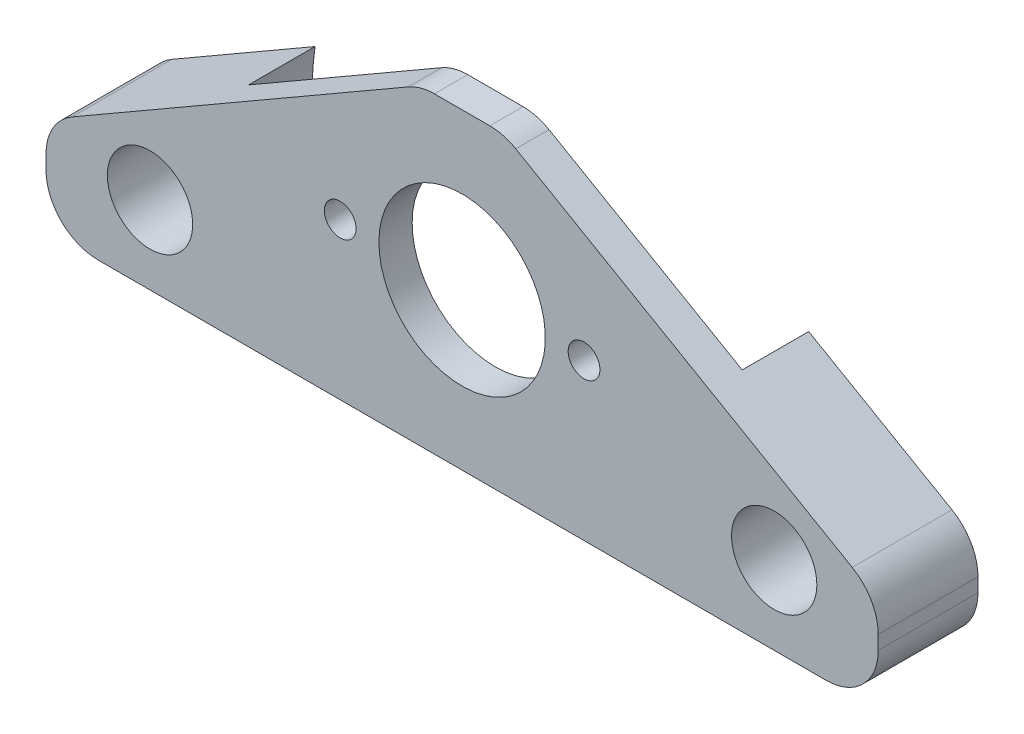
ISO-10303-21;
HEADER;
FILE_DESCRIPTION(('STEP AP214'),'2;1');
FILE_NAME('part.step','',(''),(''),'','','');
FILE_SCHEMA(('AUTOMOTIVE_DESIGN { 1 0 10303 214 1 1 1 1 }'));
ENDSEC;
DATA;
#1=APPLICATION_CONTEXT('core data for automotive mechanical design processes');
#2=APPLICATION_PROTOCOL_DEFINITION('international standard','automotive_design',2000,#1);
#3=PRODUCT_CONTEXT('',#1,'mechanical');
#4=PRODUCT('Part','Part','',(#3));
#5=PRODUCT_RELATED_PRODUCT_CATEGORY('part','',(#4));
#6=PRODUCT_DEFINITION_FORMATION('','',#4);
#7=PRODUCT_DEFINITION_CONTEXT('part definition',#1,'design');
#8=PRODUCT_DEFINITION('design','',#6,#7);
#9=PRODUCT_DEFINITION_SHAPE('','',#8);
#10=(LENGTH_UNIT() NAMED_UNIT(*) SI_UNIT(.MILLI.,.METRE.));
#11=(NAMED_UNIT(*) PLANE_ANGLE_UNIT() SI_UNIT($,.RADIAN.));
#12=(NAMED_UNIT(*) SI_UNIT($,.STERADIAN.) SOLID_ANGLE_UNIT());
#13=UNCERTAINTY_MEASURE_WITH_UNIT(LENGTH_MEASURE(1.E-05),#10,'distance_accuracy_value','');
#14=(GEOMETRIC_REPRESENTATION_CONTEXT(3) GLOBAL_UNCERTAINTY_ASSIGNED_CONTEXT((#13)) GLOBAL_UNIT_ASSIGNED_CONTEXT((#10,
#11,#12)) REPRESENTATION_CONTEXT('',''));
#15=CARTESIAN_POINT('',(0.,0.,0.));
#16=DIRECTION('',(0.,0.,1.));
#17=DIRECTION('',(1.,0.,0.));
#18=AXIS2_PLACEMENT_3D('',#15,#16,#17);
#19=CARTESIAN_POINT('',(0.,19.05,-3.03));
#20=DIRECTION('',(0.,0.,1.));
#21=DIRECTION('',(1.,0.,0.));
#22=AXIS2_PLACEMENT_3D('',#19,#20,#21);
#23=PLANE('',#22);
#24=CARTESIAN_POINT('',(0.,9.525,-3.03));
#25=DIRECTION('',(0.,0.,1.));
#26=DIRECTION('',(1.,0.,0.));
#27=AXIS2_PLACEMENT_3D('',#24,#25,#26);
#28=CIRCLE('',#27,5.08);
#29=CARTESIAN_POINT('',(5.08,9.525,-3.03));
#30=VERTEX_POINT('',#29);
#31=EDGE_CURVE('E248',#30,#30,#28,.T.);
#32=ORIENTED_EDGE('',*,*,#31,.T.);
#33=EDGE_LOOP('',(#32));
#34=FACE_BOUND('',#33,.T.);
#35=CARTESIAN_POINT('',(7.44219999999999,9.525,-3.03));
#36=DIRECTION('',(0.,0.,1.));
#37=DIRECTION('',(1.,0.,0.));
#38=AXIS2_PLACEMENT_3D('',#35,#36,#37);
#39=CIRCLE('',#38,0.97028000000001);
#40=CARTESIAN_POINT('',(8.41248000000001,9.525,-3.03));
#41=VERTEX_POINT('',#40);
#42=EDGE_CURVE('E236',#41,#41,#39,.T.);
#43=ORIENTED_EDGE('',*,*,#42,.T.);
#44=EDGE_LOOP('',(#43));
#45=FACE_BOUND('',#44,.T.);
#46=DIRECTION('',(-1.,0.,0.));
#47=VECTOR('',#46,1.);
#48=CARTESIAN_POINT('',(2.54000378596879,19.05,-3.03));
#49=LINE('',#48,#47);
#50=CARTESIAN_POINT('',(1.68926509999997,19.05,-3.03));
#51=VERTEX_POINT('',#50);
#52=CARTESIAN_POINT('',(-1.68926509999997,19.05,-3.03));
#53=VERTEX_POINT('',#52);
#54=EDGE_CURVE('E264',#51,#53,#49,.T.);
#55=ORIENTED_EDGE('',*,*,#54,.F.);
#56=CARTESIAN_POINT('',(1.68926509999997,15.875,-3.03));
#57=DIRECTION('',(0.,0.,1.));
#58=DIRECTION('',(1.,0.,0.));
#59=AXIS2_PLACEMENT_3D('',#56,#57,#58);
#60=CIRCLE('',#59,3.175);
#61=CARTESIAN_POINT('',(3.27676509999997,18.6246306570156,-3.03));
#62=VERTEX_POINT('',#61);
#63=EDGE_CURVE('E291',#51,#62,#60,.F.);
#64=ORIENTED_EDGE('',*,*,#63,.T.);
#65=DIRECTION('',(-0.866025403784439,0.5,0.));
#66=VECTOR('',#65,1.);
#67=CARTESIAN_POINT('',(25.4,5.85177503215525,-3.03));
#68=LINE('',#67,#66);
#69=CARTESIAN_POINT('',(15.0665413190862,11.8178001832408,-3.03));
#70=VERTEX_POINT('',#69);
#71=EDGE_CURVE('E280',#70,#62,#68,.T.);
#72=ORIENTED_EDGE('',*,*,#71,.F.);
#73=CARTESIAN_POINT('',(0.,9.52499999999997,-3.03));
#74=DIRECTION('',(0.,0.,1.));
#75=DIRECTION('',(-1.,0.,0.));
#76=AXIS2_PLACEMENT_3D('',#73,#74,#75);
#77=CIRCLE('',#76,15.24);
#78=CARTESIAN_POINT('',(11.896721186949,0.,-3.03));
#79=VERTEX_POINT('',#78);
#80=EDGE_CURVE('E251',#79,#70,#77,.T.);
#81=ORIENTED_EDGE('',*,*,#80,.F.);
#82=DIRECTION('',(1.,0.,0.));
#83=VECTOR('',#82,1.);
#84=CARTESIAN_POINT('',(0.,0.,-3.03));
#85=LINE('',#84,#83);
#86=CARTESIAN_POINT('',(-11.896721186949,0.,-3.03));
#87=VERTEX_POINT('',#86);
#88=EDGE_CURVE('E321',#87,#79,#85,.T.);
#89=ORIENTED_EDGE('',*,*,#88,.F.);
#90=CARTESIAN_POINT('',(0.,9.52499999999997,-3.03));
#91=DIRECTION('',(0.,0.,-1.));
#92=DIRECTION('',(1.,0.,0.));
#93=AXIS2_PLACEMENT_3D('',#90,#91,#92);
#94=CIRCLE('',#93,15.24);
#95=CARTESIAN_POINT('',(-15.0665413190862,11.8178001832408,-3.03));
#96=VERTEX_POINT('',#95);
#97=EDGE_CURVE('E161',#87,#96,#94,.T.);
#98=ORIENTED_EDGE('',*,*,#97,.T.);
#99=DIRECTION('',(0.866025403784439,0.5,0.));
#100=VECTOR('',#99,1.);
#101=CARTESIAN_POINT('',(-25.4,5.85177503215525,-3.03));
#102=LINE('',#101,#100);
#103=CARTESIAN_POINT('',(-3.27676509999997,18.6246306570156,-3.03));
#104=VERTEX_POINT('',#103);
#105=EDGE_CURVE('E174',#96,#104,#102,.T.);
#106=ORIENTED_EDGE('',*,*,#105,.T.);
#107=CARTESIAN_POINT('',(-1.68926509999997,15.875,-3.03));
#108=DIRECTION('',(0.,0.,-1.));
#109=DIRECTION('',(-1.,0.,0.));
#110=AXIS2_PLACEMENT_3D('',#107,#108,#109);
#111=CIRCLE('',#110,3.175);
#112=EDGE_CURVE('E218',#53,#104,#111,.F.);
#113=ORIENTED_EDGE('',*,*,#112,.F.);
#114=EDGE_LOOP('',(#55,#64,#72,#81,#89,#98,#106,#113));
#115=FACE_BOUND('',#114,.T.);
#116=CARTESIAN_POINT('',(-7.44219999999999,9.525,-3.03));
#117=DIRECTION('',(0.,0.,-1.));
#118=DIRECTION('',(-1.,0.,0.));
#119=AXIS2_PLACEMENT_3D('',#116,#117,#118);
#120=CIRCLE('',#119,0.97028000000001);
#121=CARTESIAN_POINT('',(-8.41248000000001,9.525,-3.03));
#122=VERTEX_POINT('',#121);
#123=EDGE_CURVE('E604',#122,#122,#120,.T.);
#124=ORIENTED_EDGE('',*,*,#123,.F.);
#125=EDGE_LOOP('',(#124));
#126=FACE_BOUND('',#125,.T.);
#127=ADVANCED_FACE('F36',(#34,#45,#115,#126),#23,.F.);
#128=CARTESIAN_POINT('',(2.54000378596879,19.05,-3.03));
#129=DIRECTION('',(0.,1.,0.));
#130=DIRECTION('',(0.,0.,1.));
#131=AXIS2_PLACEMENT_3D('',#128,#129,#130);
#132=PLANE('',#131);
#133=DIRECTION('',(-1.,0.,0.));
#134=VECTOR('',#133,1.);
#135=CARTESIAN_POINT('',(2.54000378596879,19.05,-1.));
#136=LINE('',#135,#134);
#137=CARTESIAN_POINT('',(1.68926509999997,19.05,-1.));
#138=VERTEX_POINT('',#137);
#139=CARTESIAN_POINT('',(-1.68926509999997,19.05,-1.));
#140=VERTEX_POINT('',#139);
#141=EDGE_CURVE('E314',#138,#140,#136,.T.);
#142=ORIENTED_EDGE('',*,*,#141,.F.);
#143=DIRECTION('',(0.,0.,1.));
#144=VECTOR('',#143,1.);
#145=CARTESIAN_POINT('',(1.68926509999997,19.05,-3.03));
#146=LINE('',#145,#144);
#147=EDGE_CURVE('E289',#138,#51,#146,.F.);
#148=ORIENTED_EDGE('',*,*,#147,.T.);
#149=ORIENTED_EDGE('',*,*,#54,.T.);
#150=DIRECTION('',(0.,0.,1.));
#151=VECTOR('',#150,1.);
#152=CARTESIAN_POINT('',(-1.68926509999997,19.05,-3.03));
#153=LINE('',#152,#151);
#154=EDGE_CURVE('E215',#140,#53,#153,.F.);
#155=ORIENTED_EDGE('',*,*,#154,.F.);
#156=EDGE_LOOP('',(#142,#148,#149,#155));
#157=FACE_BOUND('',#156,.T.);
#158=ADVANCED_FACE('F342',(#157),#132,.T.);
#159=CARTESIAN_POINT('',(25.4,5.85177503215525,-3.03));
#160=DIRECTION('',(0.5,0.866025403784439,0.));
#161=DIRECTION('',(-0.866025403784439,0.5,0.));
#162=AXIS2_PLACEMENT_3D('',#159,#160,#161);
#163=PLANE('',#162);
#164=ORIENTED_EDGE('',*,*,#71,.T.);
#165=DIRECTION('',(0.,0.,1.));
#166=VECTOR('',#165,1.);
#167=CARTESIAN_POINT('',(3.27676509999997,18.6246306570156,-3.03));
#168=LINE('',#167,#166);
#169=CARTESIAN_POINT('',(3.27676509999997,18.6246306570156,-1.));
#170=VERTEX_POINT('',#169);
#171=EDGE_CURVE('E279',#62,#170,#168,.T.);
#172=ORIENTED_EDGE('',*,*,#171,.T.);
#173=DIRECTION('',(-0.866025403784439,0.5,0.));
#174=VECTOR('',#173,1.);
#175=CARTESIAN_POINT('',(25.4,5.85177503215525,-1.));
#176=LINE('',#175,#174);
#177=CARTESIAN_POINT('',(23.8125,6.76831858449378,-1.));
#178=VERTEX_POINT('',#177);
#179=EDGE_CURVE('E310',#178,#170,#176,.T.);
#180=ORIENTED_EDGE('',*,*,#179,.F.);
#181=DIRECTION('',(0.,0.,1.));
#182=VECTOR('',#181,1.);
#183=CARTESIAN_POINT('',(23.8125,6.76831858449378,-3.03));
#184=LINE('',#183,#182);
#185=CARTESIAN_POINT('',(23.8125,6.76831858449379,-7.09));
#186=VERTEX_POINT('',#185);
#187=EDGE_CURVE('E277',#178,#186,#184,.F.);
#188=ORIENTED_EDGE('',*,*,#187,.T.);
#189=DIRECTION('',(0.866025403784436,-0.500000000000004,0.));
#190=VECTOR('',#189,1.);
#191=CARTESIAN_POINT('',(25.4,5.85177503215525,-7.09));
#192=LINE('',#191,#190);
#193=CARTESIAN_POINT('',(15.0665413190862,11.8178001832408,-7.09));
#194=VERTEX_POINT('',#193);
#195=EDGE_CURVE('E255',#194,#186,#192,.T.);
#196=ORIENTED_EDGE('',*,*,#195,.F.);
#197=DIRECTION('',(0.,0.,1.));
#198=VECTOR('',#197,1.);
#199=CARTESIAN_POINT('',(15.0665413190862,11.8178001832408,-7.09));
#200=LINE('',#199,#198);
#201=EDGE_CURVE('E274',#194,#70,#200,.T.);
#202=ORIENTED_EDGE('',*,*,#201,.T.);
#203=EDGE_LOOP('',(#164,#172,#180,#188,#196,#202));
#204=FACE_BOUND('',#203,.T.);
#205=ADVANCED_FACE('F328',(#204),#163,.T.);
#206=CARTESIAN_POINT('',(25.4,0.,-3.03));
#207=DIRECTION('',(1.,0.,0.));
#208=DIRECTION('',(0.,0.,-1.));
#209=AXIS2_PLACEMENT_3D('',#206,#207,#208);
#210=PLANE('',#209);
#211=DIRECTION('',(0.,1.,0.));
#212=VECTOR('',#211,1.);
#213=CARTESIAN_POINT('',(25.4,0.,-1.));
#214=LINE('',#213,#212);
#215=CARTESIAN_POINT('',(25.4,3.175,-1.));
#216=VERTEX_POINT('',#215);
#217=CARTESIAN_POINT('',(25.4,4.01868792747819,-1.));
#218=VERTEX_POINT('',#217);
#219=EDGE_CURVE('E302',#216,#218,#214,.T.);
#220=ORIENTED_EDGE('',*,*,#219,.F.);
#221=DIRECTION('',(0.,0.,1.));
#222=VECTOR('',#221,1.);
#223=CARTESIAN_POINT('',(25.4,3.175,-3.03));
#224=LINE('',#223,#222);
#225=CARTESIAN_POINT('',(25.4,3.175,-7.09));
#226=VERTEX_POINT('',#225);
#227=EDGE_CURVE('E51',#216,#226,#224,.F.);
#228=ORIENTED_EDGE('',*,*,#227,.T.);
#229=DIRECTION('',(0.,-1.,0.));
#230=VECTOR('',#229,1.);
#231=CARTESIAN_POINT('',(25.4,0.,-7.09));
#232=LINE('',#231,#230);
#233=CARTESIAN_POINT('',(25.4,4.01868792747819,-7.09));
#234=VERTEX_POINT('',#233);
#235=EDGE_CURVE('E257',#234,#226,#232,.T.);
#236=ORIENTED_EDGE('',*,*,#235,.F.);
#237=DIRECTION('',(0.,0.,1.));
#238=VECTOR('',#237,1.);
#239=CARTESIAN_POINT('',(25.4,4.01868792747819,-3.03));
#240=LINE('',#239,#238);
#241=EDGE_CURVE('E296',#234,#218,#240,.T.);
#242=ORIENTED_EDGE('',*,*,#241,.T.);
#243=EDGE_LOOP('',(#220,#228,#236,#242));
#244=FACE_BOUND('',#243,.T.);
#245=ADVANCED_FACE('F301',(#244),#210,.T.);
#246=CARTESIAN_POINT('',(0.,0.,-3.03));
#247=DIRECTION('',(0.,-1.,0.));
#248=DIRECTION('',(0.,0.,-1.));
#249=AXIS2_PLACEMENT_3D('',#246,#247,#248);
#250=PLANE('',#249);
#251=DIRECTION('',(-1.,0.,0.));
#252=VECTOR('',#251,1.);
#253=CARTESIAN_POINT('',(11.8967211869489,0.,-7.09));
#254=LINE('',#253,#252);
#255=CARTESIAN_POINT('',(22.225,0.,-7.09));
#256=VERTEX_POINT('',#255);
#257=CARTESIAN_POINT('',(11.8967211869489,0.,-7.09));
#258=VERTEX_POINT('',#257);
#259=EDGE_CURVE('E259',#256,#258,#254,.T.);
#260=ORIENTED_EDGE('',*,*,#259,.F.);
#261=DIRECTION('',(0.,0.,1.));
#262=VECTOR('',#261,1.);
#263=CARTESIAN_POINT('',(22.225,0.,-3.03));
#264=LINE('',#263,#262);
#265=CARTESIAN_POINT('',(22.225,0.,-1.));
#266=VERTEX_POINT('',#265);
#267=EDGE_CURVE('E293',#256,#266,#264,.T.);
#268=ORIENTED_EDGE('',*,*,#267,.T.);
#269=DIRECTION('',(1.,0.,0.));
#270=VECTOR('',#269,1.);
#271=CARTESIAN_POINT('',(0.,0.,-1.));
#272=LINE('',#271,#270);
#273=CARTESIAN_POINT('',(-22.225,0.,-1.));
#274=VERTEX_POINT('',#273);
#275=EDGE_CURVE('E311',#274,#266,#272,.T.);
#276=ORIENTED_EDGE('',*,*,#275,.F.);
#277=DIRECTION('',(0.,0.,1.));
#278=VECTOR('',#277,1.);
#279=CARTESIAN_POINT('',(-22.225,0.,-3.03));
#280=LINE('',#279,#278);
#281=CARTESIAN_POINT('',(-22.225,0.,-7.09));
#282=VERTEX_POINT('',#281);
#283=EDGE_CURVE('E221',#282,#274,#280,.T.);
#284=ORIENTED_EDGE('',*,*,#283,.F.);
#285=DIRECTION('',(1.,0.,0.));
#286=VECTOR('',#285,1.);
#287=CARTESIAN_POINT('',(-11.8967211869489,0.,-7.09));
#288=LINE('',#287,#286);
#289=CARTESIAN_POINT('',(-11.8967211869489,0.,-7.09));
#290=VERTEX_POINT('',#289);
#291=EDGE_CURVE('E181',#282,#290,#288,.T.);
#292=ORIENTED_EDGE('',*,*,#291,.T.);
#293=DIRECTION('',(0.,0.,1.));
#294=VECTOR('',#293,1.);
#295=CARTESIAN_POINT('',(-11.8967211869489,0.,-7.09));
#296=LINE('',#295,#294);
#297=EDGE_CURVE('E156',#290,#87,#296,.T.);
#298=ORIENTED_EDGE('',*,*,#297,.T.);
#299=ORIENTED_EDGE('',*,*,#88,.T.);
#300=DIRECTION('',(0.,0.,1.));
#301=VECTOR('',#300,1.);
#302=CARTESIAN_POINT('',(11.8967211869489,0.,-7.09));
#303=LINE('',#302,#301);
#304=EDGE_CURVE('E261',#258,#79,#303,.T.);
#305=ORIENTED_EDGE('',*,*,#304,.F.);
#306=EDGE_LOOP('',(#260,#268,#276,#284,#292,#298,#299,#305));
#307=FACE_BOUND('',#306,.T.);
#308=ADVANCED_FACE('F339',(#307),#250,.T.);
#309=CARTESIAN_POINT('',(0.,19.05,-1.));
#310=DIRECTION('',(0.,0.,1.));
#311=DIRECTION('',(1.,0.,0.));
#312=AXIS2_PLACEMENT_3D('',#309,#310,#311);
#313=PLANE('',#312);
#314=CARTESIAN_POINT('',(0.,9.525,-1.));
#315=DIRECTION('',(0.,0.,-1.));
#316=DIRECTION('',(-1.,0.,0.));
#317=AXIS2_PLACEMENT_3D('',#314,#315,#316);
#318=CIRCLE('',#317,5.08);
#319=CARTESIAN_POINT('',(-5.08,9.525,-1.));
#320=VERTEX_POINT('',#319);
#321=EDGE_CURVE('E243',#320,#320,#318,.T.);
#322=ORIENTED_EDGE('',*,*,#321,.T.);
#323=EDGE_LOOP('',(#322));
#324=FACE_BOUND('',#323,.T.);
#325=CARTESIAN_POINT('',(7.44219999999999,9.525,-1.));
#326=DIRECTION('',(0.,0.,-1.));
#327=DIRECTION('',(1.,0.,0.));
#328=AXIS2_PLACEMENT_3D('',#325,#326,#327);
#329=CIRCLE('',#328,0.97028000000001);
#330=CARTESIAN_POINT('',(8.41248000000001,9.525,-1.));
#331=VERTEX_POINT('',#330);
#332=EDGE_CURVE('E233',#331,#331,#329,.T.);
#333=ORIENTED_EDGE('',*,*,#332,.T.);
#334=EDGE_LOOP('',(#333));
#335=FACE_BOUND('',#334,.T.);
#336=CARTESIAN_POINT('',(19.05,4.7625,-1.));
#337=DIRECTION('',(0.,0.,-1.));
#338=DIRECTION('',(1.,0.,0.));
#339=AXIS2_PLACEMENT_3D('',#336,#337,#338);
#340=CIRCLE('',#339,2.60349999999999);
#341=CARTESIAN_POINT('',(21.6535,4.7625,-1.));
#342=VERTEX_POINT('',#341);
#343=EDGE_CURVE('E240',#342,#342,#340,.T.);
#344=ORIENTED_EDGE('',*,*,#343,.T.);
#345=EDGE_LOOP('',(#344));
#346=FACE_BOUND('',#345,.T.);
#347=ORIENTED_EDGE('',*,*,#179,.T.);
#348=CARTESIAN_POINT('',(1.68926509999997,15.875,-1.));
#349=DIRECTION('',(0.,0.,1.));
#350=DIRECTION('',(1.,0.,0.));
#351=AXIS2_PLACEMENT_3D('',#348,#349,#350);
#352=CIRCLE('',#351,3.175);
#353=EDGE_CURVE('E287',#170,#138,#352,.T.);
#354=ORIENTED_EDGE('',*,*,#353,.T.);
#355=ORIENTED_EDGE('',*,*,#141,.T.);
#356=CARTESIAN_POINT('',(-1.68926509999997,15.875,-1.));
#357=DIRECTION('',(0.,0.,-1.));
#358=DIRECTION('',(-1.,0.,0.));
#359=AXIS2_PLACEMENT_3D('',#356,#357,#358);
#360=CIRCLE('',#359,3.175);
#361=CARTESIAN_POINT('',(-3.27676509999997,18.6246306570156,-1.));
#362=VERTEX_POINT('',#361);
#363=EDGE_CURVE('E212',#362,#140,#360,.T.);
#364=ORIENTED_EDGE('',*,*,#363,.F.);
#365=DIRECTION('',(0.866025403784439,0.5,0.));
#366=VECTOR('',#365,1.);
#367=CARTESIAN_POINT('',(-25.4,5.85177503215525,-1.));
#368=LINE('',#367,#366);
#369=CARTESIAN_POINT('',(-23.8125,6.76831858449378,-1.));
#370=VERTEX_POINT('',#369);
#371=EDGE_CURVE('E179',#370,#362,#368,.T.);
#372=ORIENTED_EDGE('',*,*,#371,.F.);
#373=CARTESIAN_POINT('',(-22.225,4.01868792747819,-1.));
#374=DIRECTION('',(0.,0.,-1.));
#375=DIRECTION('',(-1.,0.,0.));
#376=AXIS2_PLACEMENT_3D('',#373,#374,#375);
#377=CIRCLE('',#376,3.175);
#378=CARTESIAN_POINT('',(-25.4,4.01868792747819,-1.));
#379=VERTEX_POINT('',#378);
#380=EDGE_CURVE('E205',#379,#370,#377,.T.);
#381=ORIENTED_EDGE('',*,*,#380,.F.);
#382=DIRECTION('',(0.,1.,0.));
#383=VECTOR('',#382,1.);
#384=CARTESIAN_POINT('',(-25.4,0.,-1.));
#385=LINE('',#384,#383);
#386=CARTESIAN_POINT('',(-25.4,3.175,-1.));
#387=VERTEX_POINT('',#386);
#388=EDGE_CURVE('E176',#387,#379,#385,.T.);
#389=ORIENTED_EDGE('',*,*,#388,.F.);
#390=CARTESIAN_POINT('',(-22.225,3.175,-1.));
#391=DIRECTION('',(0.,0.,-1.));
#392=DIRECTION('',(-1.,0.,0.));
#393=AXIS2_PLACEMENT_3D('',#390,#391,#392);
#394=CIRCLE('',#393,3.175);
#395=EDGE_CURVE('E210',#274,#387,#394,.T.);
#396=ORIENTED_EDGE('',*,*,#395,.F.);
#397=ORIENTED_EDGE('',*,*,#275,.T.);
#398=CARTESIAN_POINT('',(22.225,3.175,-1.));
#399=DIRECTION('',(0.,0.,1.));
#400=DIRECTION('',(1.,0.,0.));
#401=AXIS2_PLACEMENT_3D('',#398,#399,#400);
#402=CIRCLE('',#401,3.175);
#403=EDGE_CURVE('E285',#266,#216,#402,.T.);
#404=ORIENTED_EDGE('',*,*,#403,.T.);
#405=ORIENTED_EDGE('',*,*,#219,.T.);
#406=CARTESIAN_POINT('',(22.225,4.01868792747819,-1.));
#407=DIRECTION('',(0.,0.,1.));
#408=DIRECTION('',(1.,0.,0.));
#409=AXIS2_PLACEMENT_3D('',#406,#407,#408);
#410=CIRCLE('',#409,3.175);
#411=EDGE_CURVE('E283',#218,#178,#410,.T.);
#412=ORIENTED_EDGE('',*,*,#411,.T.);
#413=EDGE_LOOP('',(#347,#354,#355,#364,#372,#381,#389,#396,#397,#404,#405,#412));
#414=FACE_BOUND('',#413,.T.);
#415=CARTESIAN_POINT('',(-7.44219999999999,9.525,-1.));
#416=DIRECTION('',(0.,0.,1.));
#417=DIRECTION('',(-1.,0.,0.));
#418=AXIS2_PLACEMENT_3D('',#415,#416,#417);
#419=CIRCLE('',#418,0.97028000000001);
#420=CARTESIAN_POINT('',(-8.41248000000001,9.525,-1.));
#421=VERTEX_POINT('',#420);
#422=EDGE_CURVE('E601',#421,#421,#419,.T.);
#423=ORIENTED_EDGE('',*,*,#422,.F.);
#424=EDGE_LOOP('',(#423));
#425=FACE_BOUND('',#424,.T.);
#426=CARTESIAN_POINT('',(-19.05,4.7625,-1.));
#427=DIRECTION('',(0.,0.,1.));
#428=DIRECTION('',(-1.,0.,0.));
#429=AXIS2_PLACEMENT_3D('',#426,#427,#428);
#430=CIRCLE('',#429,2.60349999999999);
#431=CARTESIAN_POINT('',(-21.6535,4.7625,-1.));
#432=VERTEX_POINT('',#431);
#433=EDGE_CURVE('E190',#432,#432,#430,.T.);
#434=ORIENTED_EDGE('',*,*,#433,.F.);
#435=EDGE_LOOP('',(#434));
#436=FACE_BOUND('',#435,.T.);
#437=ADVANCED_FACE('F306',(#324,#335,#346,#414,#425,#436),#313,.T.);
#438=CARTESIAN_POINT('',(0.,9.52499999999997,-7.09));
#439=DIRECTION('',(0.,0.,1.));
#440=DIRECTION('',(1.,0.,0.));
#441=AXIS2_PLACEMENT_3D('',#438,#439,#440);
#442=CYLINDRICAL_SURFACE('',#441,15.24);
#443=ORIENTED_EDGE('',*,*,#80,.T.);
#444=ORIENTED_EDGE('',*,*,#201,.F.);
#445=CARTESIAN_POINT('',(0.,9.52499999999997,-7.09));
#446=DIRECTION('',(0.,0.,1.));
#447=DIRECTION('',(-1.,0.,0.));
#448=AXIS2_PLACEMENT_3D('',#445,#446,#447);
#449=CIRCLE('',#448,15.24);
#450=EDGE_CURVE('E252',#258,#194,#449,.T.);
#451=ORIENTED_EDGE('',*,*,#450,.F.);
#452=ORIENTED_EDGE('',*,*,#304,.T.);
#453=EDGE_LOOP('',(#443,#444,#451,#452));
#454=FACE_BOUND('',#453,.T.);
#455=ADVANCED_FACE('F332',(#454),#442,.F.);
#456=CARTESIAN_POINT('',(0.,9.52499999999997,-7.09));
#457=DIRECTION('',(0.,0.,-1.));
#458=DIRECTION('',(-1.,0.,0.));
#459=AXIS2_PLACEMENT_3D('',#456,#457,#458);
#460=PLANE('',#459);
#461=CARTESIAN_POINT('',(19.05,4.7625,-7.09));
#462=DIRECTION('',(0.,0.,-1.));
#463=DIRECTION('',(1.,0.,0.));
#464=AXIS2_PLACEMENT_3D('',#461,#462,#463);
#465=CIRCLE('',#464,2.60349999999999);
#466=CARTESIAN_POINT('',(21.6535,4.7625,-7.09));
#467=VERTEX_POINT('',#466);
#468=EDGE_CURVE('E239',#467,#467,#465,.T.);
#469=ORIENTED_EDGE('',*,*,#468,.F.);
#470=EDGE_LOOP('',(#469));
#471=FACE_BOUND('',#470,.T.);
#472=ORIENTED_EDGE('',*,*,#235,.T.);
#473=CARTESIAN_POINT('',(22.225,3.175,-7.09));
#474=DIRECTION('',(0.,0.,-1.));
#475=DIRECTION('',(-1.,0.,0.));
#476=AXIS2_PLACEMENT_3D('',#473,#474,#475);
#477=CIRCLE('',#476,3.175);
#478=EDGE_CURVE('E11',#226,#256,#477,.T.);
#479=ORIENTED_EDGE('',*,*,#478,.T.);
#480=ORIENTED_EDGE('',*,*,#259,.T.);
#481=ORIENTED_EDGE('',*,*,#450,.T.);
#482=ORIENTED_EDGE('',*,*,#195,.T.);
#483=CARTESIAN_POINT('',(22.225,4.01868792747819,-7.09));
#484=DIRECTION('',(0.,0.,-1.));
#485=DIRECTION('',(-1.,0.,0.));
#486=AXIS2_PLACEMENT_3D('',#483,#484,#485);
#487=CIRCLE('',#486,3.175);
#488=EDGE_CURVE('E44',#186,#234,#487,.T.);
#489=ORIENTED_EDGE('',*,*,#488,.T.);
#490=EDGE_LOOP('',(#472,#479,#480,#481,#482,#489));
#491=FACE_BOUND('',#490,.T.);
#492=ADVANCED_FACE('F362',(#471,#491),#460,.T.);
#493=CARTESIAN_POINT('',(0.,9.525,-1.));
#494=DIRECTION('',(0.,0.,-1.));
#495=DIRECTION('',(-1.,0.,0.));
#496=AXIS2_PLACEMENT_3D('',#493,#494,#495);
#497=CYLINDRICAL_SURFACE('',#496,5.08);
#498=ORIENTED_EDGE('',*,*,#31,.F.);
#499=EDGE_LOOP('',(#498));
#500=FACE_BOUND('',#499,.T.);
#501=ORIENTED_EDGE('',*,*,#321,.F.);
#502=EDGE_LOOP('',(#501));
#503=FACE_BOUND('',#502,.T.);
#504=ADVANCED_FACE('F419',(#500,#503),#497,.F.);
#505=CARTESIAN_POINT('',(19.05,4.7625,-1.));
#506=DIRECTION('',(0.,0.,-1.));
#507=DIRECTION('',(-1.,0.,0.));
#508=AXIS2_PLACEMENT_3D('',#505,#506,#507);
#509=CYLINDRICAL_SURFACE('',#508,2.60349999999999);
#510=ORIENTED_EDGE('',*,*,#343,.F.);
#511=EDGE_LOOP('',(#510));
#512=FACE_BOUND('',#511,.T.);
#513=ORIENTED_EDGE('',*,*,#468,.T.);
#514=EDGE_LOOP('',(#513));
#515=FACE_BOUND('',#514,.T.);
#516=ADVANCED_FACE('F373',(#512,#515),#509,.F.);
#517=CARTESIAN_POINT('',(7.44219999999999,9.525,-1.));
#518=DIRECTION('',(0.,0.,-1.));
#519=DIRECTION('',(-1.,0.,0.));
#520=AXIS2_PLACEMENT_3D('',#517,#518,#519);
#521=CYLINDRICAL_SURFACE('',#520,0.97028000000001);
#522=ORIENTED_EDGE('',*,*,#332,.F.);
#523=EDGE_LOOP('',(#522));
#524=FACE_BOUND('',#523,.T.);
#525=ORIENTED_EDGE('',*,*,#42,.F.);
#526=EDGE_LOOP('',(#525));
#527=FACE_BOUND('',#526,.T.);
#528=ADVANCED_FACE('F367',(#524,#527),#521,.F.);
#529=CARTESIAN_POINT('',(1.68926509999997,15.875,-3.03));
#530=DIRECTION('',(0.,0.,1.));
#531=DIRECTION('',(1.,0.,0.));
#532=AXIS2_PLACEMENT_3D('',#529,#530,#531);
#533=CYLINDRICAL_SURFACE('',#532,3.175);
#534=ORIENTED_EDGE('',*,*,#63,.F.);
#535=ORIENTED_EDGE('',*,*,#147,.F.);
#536=ORIENTED_EDGE('',*,*,#353,.F.);
#537=ORIENTED_EDGE('',*,*,#171,.F.);
#538=EDGE_LOOP('',(#534,#535,#536,#537));
#539=FACE_BOUND('',#538,.T.);
#540=ADVANCED_FACE('F365',(#539),#533,.T.);
#541=CARTESIAN_POINT('',(22.225,3.175,-3.03));
#542=DIRECTION('',(0.,0.,1.));
#543=DIRECTION('',(1.,0.,0.));
#544=AXIS2_PLACEMENT_3D('',#541,#542,#543);
#545=CYLINDRICAL_SURFACE('',#544,3.175);
#546=ORIENTED_EDGE('',*,*,#478,.F.);
#547=ORIENTED_EDGE('',*,*,#227,.F.);
#548=ORIENTED_EDGE('',*,*,#403,.F.);
#549=ORIENTED_EDGE('',*,*,#267,.F.);
#550=EDGE_LOOP('',(#546,#547,#548,#549));
#551=FACE_BOUND('',#550,.T.);
#552=ADVANCED_FACE('F361',(#551),#545,.T.);
#553=CARTESIAN_POINT('',(22.225,4.01868792747819,-3.03));
#554=DIRECTION('',(0.,0.,1.));
#555=DIRECTION('',(1.,0.,0.));
#556=AXIS2_PLACEMENT_3D('',#553,#554,#555);
#557=CYLINDRICAL_SURFACE('',#556,3.175);
#558=ORIENTED_EDGE('',*,*,#488,.F.);
#559=ORIENTED_EDGE('',*,*,#187,.F.);
#560=ORIENTED_EDGE('',*,*,#411,.F.);
#561=ORIENTED_EDGE('',*,*,#241,.F.);
#562=EDGE_LOOP('',(#558,#559,#560,#561));
#563=FACE_BOUND('',#562,.T.);
#564=ADVANCED_FACE('F38',(#563),#557,.T.);
#565=CARTESIAN_POINT('',(-25.4,5.85177503215525,-3.03));
#566=DIRECTION('',(-0.5,0.866025403784439,0.));
#567=DIRECTION('',(0.866025403784439,0.5,0.));
#568=AXIS2_PLACEMENT_3D('',#565,#566,#567);
#569=PLANE('',#568);
#570=ORIENTED_EDGE('',*,*,#105,.F.);
#571=DIRECTION('',(0.,0.,1.));
#572=VECTOR('',#571,1.);
#573=CARTESIAN_POINT('',(-15.0665413190862,11.8178001832408,-7.09));
#574=LINE('',#573,#572);
#575=CARTESIAN_POINT('',(-15.0665413190862,11.8178001832408,-7.09));
#576=VERTEX_POINT('',#575);
#577=EDGE_CURVE('E153',#576,#96,#574,.T.);
#578=ORIENTED_EDGE('',*,*,#577,.F.);
#579=DIRECTION('',(-0.866025403784436,-0.500000000000004,0.));
#580=VECTOR('',#579,1.);
#581=CARTESIAN_POINT('',(-25.4,5.85177503215525,-7.09));
#582=LINE('',#581,#580);
#583=CARTESIAN_POINT('',(-23.8125,6.76831858449379,-7.09));
#584=VERTEX_POINT('',#583);
#585=EDGE_CURVE('E160',#576,#584,#582,.T.);
#586=ORIENTED_EDGE('',*,*,#585,.T.);
#587=DIRECTION('',(0.,0.,1.));
#588=VECTOR('',#587,1.);
#589=CARTESIAN_POINT('',(-23.8125,6.76831858449378,-3.03));
#590=LINE('',#589,#588);
#591=EDGE_CURVE('E198',#370,#584,#590,.F.);
#592=ORIENTED_EDGE('',*,*,#591,.F.);
#593=ORIENTED_EDGE('',*,*,#371,.T.);
#594=DIRECTION('',(0.,0.,1.));
#595=VECTOR('',#594,1.);
#596=CARTESIAN_POINT('',(-3.27676509999997,18.6246306570156,-3.03));
#597=LINE('',#596,#595);
#598=EDGE_CURVE('E201',#104,#362,#597,.T.);
#599=ORIENTED_EDGE('',*,*,#598,.F.);
#600=EDGE_LOOP('',(#570,#578,#586,#592,#593,#599));
#601=FACE_BOUND('',#600,.T.);
#602=ADVANCED_FACE('F172',(#601),#569,.T.);
#603=CARTESIAN_POINT('',(-25.4,0.,-3.03));
#604=DIRECTION('',(-1.,0.,0.));
#605=DIRECTION('',(0.,0.,-1.));
#606=AXIS2_PLACEMENT_3D('',#603,#604,#605);
#607=PLANE('',#606);
#608=ORIENTED_EDGE('',*,*,#388,.T.);
#609=DIRECTION('',(0.,0.,1.));
#610=VECTOR('',#609,1.);
#611=CARTESIAN_POINT('',(-25.4,4.01868792747819,-3.03));
#612=LINE('',#611,#610);
#613=CARTESIAN_POINT('',(-25.4,4.01868792747819,-7.09));
#614=VERTEX_POINT('',#613);
#615=EDGE_CURVE('E224',#614,#379,#612,.T.);
#616=ORIENTED_EDGE('',*,*,#615,.F.);
#617=DIRECTION('',(0.,-1.,0.));
#618=VECTOR('',#617,1.);
#619=CARTESIAN_POINT('',(-25.4,0.,-7.09));
#620=LINE('',#619,#618);
#621=CARTESIAN_POINT('',(-25.4,3.175,-7.09));
#622=VERTEX_POINT('',#621);
#623=EDGE_CURVE('E170',#614,#622,#620,.T.);
#624=ORIENTED_EDGE('',*,*,#623,.T.);
#625=DIRECTION('',(0.,0.,1.));
#626=VECTOR('',#625,1.);
#627=CARTESIAN_POINT('',(-25.4,3.175,-3.03));
#628=LINE('',#627,#626);
#629=EDGE_CURVE('E227',#387,#622,#628,.F.);
#630=ORIENTED_EDGE('',*,*,#629,.F.);
#631=EDGE_LOOP('',(#608,#616,#624,#630));
#632=FACE_BOUND('',#631,.T.);
#633=ADVANCED_FACE('F354',(#632),#607,.T.);
#634=CARTESIAN_POINT('',(0.,9.52499999999997,-7.09));
#635=DIRECTION('',(0.,0.,1.));
#636=DIRECTION('',(-1.,0.,0.));
#637=AXIS2_PLACEMENT_3D('',#634,#635,#636);
#638=CYLINDRICAL_SURFACE('',#637,15.24);
#639=ORIENTED_EDGE('',*,*,#97,.F.);
#640=ORIENTED_EDGE('',*,*,#297,.F.);
#641=CARTESIAN_POINT('',(0.,9.52499999999997,-7.09));
#642=DIRECTION('',(0.,0.,-1.));
#643=DIRECTION('',(1.,0.,0.));
#644=AXIS2_PLACEMENT_3D('',#641,#642,#643);
#645=CIRCLE('',#644,15.24);
#646=EDGE_CURVE('E148',#290,#576,#645,.T.);
#647=ORIENTED_EDGE('',*,*,#646,.T.);
#648=ORIENTED_EDGE('',*,*,#577,.T.);
#649=EDGE_LOOP('',(#639,#640,#647,#648));
#650=FACE_BOUND('',#649,.T.);
#651=ADVANCED_FACE('F151',(#650),#638,.F.);
#652=CARTESIAN_POINT('',(0.,9.52499999999997,-7.09));
#653=DIRECTION('',(0.,0.,-1.));
#654=DIRECTION('',(1.,0.,0.));
#655=AXIS2_PLACEMENT_3D('',#652,#653,#654);
#656=PLANE('',#655);
#657=CARTESIAN_POINT('',(-19.05,4.7625,-7.09));
#658=DIRECTION('',(0.,0.,1.));
#659=DIRECTION('',(-1.,0.,0.));
#660=AXIS2_PLACEMENT_3D('',#657,#658,#659);
#661=CIRCLE('',#660,2.60349999999999);
#662=CARTESIAN_POINT('',(-21.6535,4.7625,-7.09));
#663=VERTEX_POINT('',#662);
#664=EDGE_CURVE('E605',#663,#663,#661,.T.);
#665=ORIENTED_EDGE('',*,*,#664,.T.);
#666=EDGE_LOOP('',(#665));
#667=FACE_BOUND('',#666,.T.);
#668=ORIENTED_EDGE('',*,*,#623,.F.);
#669=CARTESIAN_POINT('',(-22.225,4.01868792747819,-7.09));
#670=DIRECTION('',(0.,0.,1.));
#671=DIRECTION('',(1.,0.,0.));
#672=AXIS2_PLACEMENT_3D('',#669,#670,#671);
#673=CIRCLE('',#672,3.175);
#674=EDGE_CURVE('E166',#584,#614,#673,.T.);
#675=ORIENTED_EDGE('',*,*,#674,.F.);
#676=ORIENTED_EDGE('',*,*,#585,.F.);
#677=ORIENTED_EDGE('',*,*,#646,.F.);
#678=ORIENTED_EDGE('',*,*,#291,.F.);
#679=CARTESIAN_POINT('',(-22.225,3.175,-7.09));
#680=DIRECTION('',(0.,0.,1.));
#681=DIRECTION('',(1.,0.,0.));
#682=AXIS2_PLACEMENT_3D('',#679,#680,#681);
#683=CIRCLE('',#682,3.175);
#684=EDGE_CURVE('E231',#622,#282,#683,.T.);
#685=ORIENTED_EDGE('',*,*,#684,.F.);
#686=EDGE_LOOP('',(#668,#675,#676,#677,#678,#685));
#687=FACE_BOUND('',#686,.T.);
#688=ADVANCED_FACE('F165',(#667,#687),#656,.T.);
#689=CARTESIAN_POINT('',(-19.05,4.7625,-1.));
#690=DIRECTION('',(0.,0.,-1.));
#691=DIRECTION('',(1.,0.,0.));
#692=AXIS2_PLACEMENT_3D('',#689,#690,#691);
#693=CYLINDRICAL_SURFACE('',#692,2.60349999999999);
#694=ORIENTED_EDGE('',*,*,#433,.T.);
#695=EDGE_LOOP('',(#694));
#696=FACE_BOUND('',#695,.T.);
#697=ORIENTED_EDGE('',*,*,#664,.F.);
#698=EDGE_LOOP('',(#697));
#699=FACE_BOUND('',#698,.T.);
#700=ADVANCED_FACE('F533',(#696,#699),#693,.F.);
#701=CARTESIAN_POINT('',(-7.44219999999999,9.525,-1.));
#702=DIRECTION('',(0.,0.,-1.));
#703=DIRECTION('',(1.,0.,0.));
#704=AXIS2_PLACEMENT_3D('',#701,#702,#703);
#705=CYLINDRICAL_SURFACE('',#704,0.97028000000001);
#706=ORIENTED_EDGE('',*,*,#422,.T.);
#707=EDGE_LOOP('',(#706));
#708=FACE_BOUND('',#707,.T.);
#709=ORIENTED_EDGE('',*,*,#123,.T.);
#710=EDGE_LOOP('',(#709));
#711=FACE_BOUND('',#710,.T.);
#712=ADVANCED_FACE('F541',(#708,#711),#705,.F.);
#713=CARTESIAN_POINT('',(-1.68926509999997,15.875,-3.03));
#714=DIRECTION('',(0.,0.,1.));
#715=DIRECTION('',(-1.,0.,0.));
#716=AXIS2_PLACEMENT_3D('',#713,#714,#715);
#717=CYLINDRICAL_SURFACE('',#716,3.175);
#718=ORIENTED_EDGE('',*,*,#112,.T.);
#719=ORIENTED_EDGE('',*,*,#598,.T.);
#720=ORIENTED_EDGE('',*,*,#363,.T.);
#721=ORIENTED_EDGE('',*,*,#154,.T.);
#722=EDGE_LOOP('',(#718,#719,#720,#721));
#723=FACE_BOUND('',#722,.T.);
#724=ADVANCED_FACE('F346',(#723),#717,.T.);
#725=CARTESIAN_POINT('',(-22.225,3.175,-3.03));
#726=DIRECTION('',(0.,0.,1.));
#727=DIRECTION('',(-1.,0.,0.));
#728=AXIS2_PLACEMENT_3D('',#725,#726,#727);
#729=CYLINDRICAL_SURFACE('',#728,3.175);
#730=ORIENTED_EDGE('',*,*,#684,.T.);
#731=ORIENTED_EDGE('',*,*,#283,.T.);
#732=ORIENTED_EDGE('',*,*,#395,.T.);
#733=ORIENTED_EDGE('',*,*,#629,.T.);
#734=EDGE_LOOP('',(#730,#731,#732,#733));
#735=FACE_BOUND('',#734,.T.);
#736=ADVANCED_FACE('F356',(#735),#729,.T.);
#737=CARTESIAN_POINT('',(-22.225,4.01868792747819,-3.03));
#738=DIRECTION('',(0.,0.,1.));
#739=DIRECTION('',(-1.,0.,0.));
#740=AXIS2_PLACEMENT_3D('',#737,#738,#739);
#741=CYLINDRICAL_SURFACE('',#740,3.175);
#742=ORIENTED_EDGE('',*,*,#674,.T.);
#743=ORIENTED_EDGE('',*,*,#615,.T.);
#744=ORIENTED_EDGE('',*,*,#380,.T.);
#745=ORIENTED_EDGE('',*,*,#591,.T.);
#746=EDGE_LOOP('',(#742,#743,#744,#745));
#747=FACE_BOUND('',#746,.T.);
#748=ADVANCED_FACE('F350',(#747),#741,.T.);
#749=CLOSED_SHELL('',(#127,#158,#205,#245,#308,#437,#455,#492,#504,#516,#528,#540,#552,#564,
#602,#633,#651,#688,#700,#712,#724,#736,#748));
#750=MANIFOLD_SOLID_BREP('B2',#749);
#751=ADVANCED_BREP_SHAPE_REPRESENTATION('',(#18,#750),#14);
#752=SHAPE_DEFINITION_REPRESENTATION(#9,#751);
ENDSEC;
END-ISO-10303-21;
